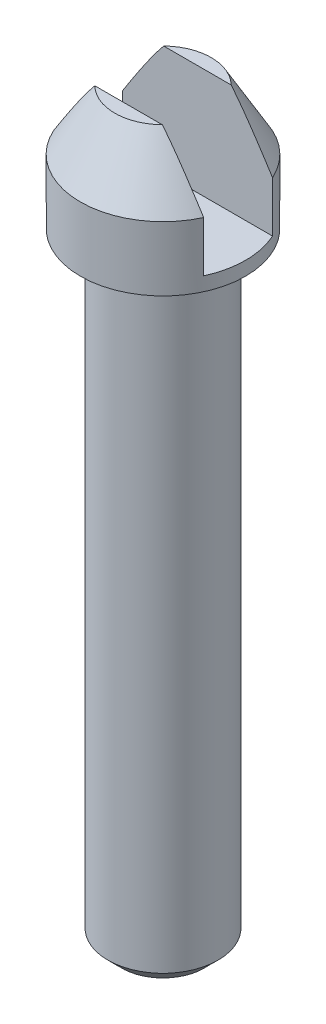
ISO-10303-21;
HEADER;
FILE_DESCRIPTION(('STEP AP214'),'2;1');
FILE_NAME('part.step','',(''),(''),'','','');
FILE_SCHEMA(('AUTOMOTIVE_DESIGN { 1 0 10303 214 1 1 1 1 }'));
ENDSEC;
DATA;
#1=APPLICATION_CONTEXT('core data for automotive mechanical design processes');
#2=APPLICATION_PROTOCOL_DEFINITION('international standard','automotive_design',2000,#1);
#3=PRODUCT_CONTEXT('',#1,'mechanical');
#4=PRODUCT('Part','Part','',(#3));
#5=PRODUCT_RELATED_PRODUCT_CATEGORY('part','',(#4));
#6=PRODUCT_DEFINITION_FORMATION('','',#4);
#7=PRODUCT_DEFINITION_CONTEXT('part definition',#1,'design');
#8=PRODUCT_DEFINITION('design','',#6,#7);
#9=PRODUCT_DEFINITION_SHAPE('','',#8);
#10=(LENGTH_UNIT() NAMED_UNIT(*) SI_UNIT(.MILLI.,.METRE.));
#11=(NAMED_UNIT(*) PLANE_ANGLE_UNIT() SI_UNIT($,.RADIAN.));
#12=(NAMED_UNIT(*) SI_UNIT($,.STERADIAN.) SOLID_ANGLE_UNIT());
#13=UNCERTAINTY_MEASURE_WITH_UNIT(LENGTH_MEASURE(1.E-05),#10,'distance_accuracy_value','');
#14=(GEOMETRIC_REPRESENTATION_CONTEXT(3) GLOBAL_UNCERTAINTY_ASSIGNED_CONTEXT((#13)) GLOBAL_UNIT_ASSIGNED_CONTEXT((#10,
#11,#12)) REPRESENTATION_CONTEXT('',''));
#15=CARTESIAN_POINT('',(0.,0.,0.));
#16=DIRECTION('',(0.,0.,1.));
#17=DIRECTION('',(1.,0.,0.));
#18=AXIS2_PLACEMENT_3D('',#15,#16,#17);
#19=CARTESIAN_POINT('',(0.,54.,0.));
#20=DIRECTION('',(0.,1.,0.));
#21=DIRECTION('',(0.,0.,1.));
#22=AXIS2_PLACEMENT_3D('',#19,#20,#21);
#23=PLANE('',#22);
#24=DIRECTION('',(-1.,0.,0.));
#25=VECTOR('',#24,1.);
#26=CARTESIAN_POINT('',(-7.,54.,-2.5));
#27=LINE('',#26,#25);
#28=CARTESIAN_POINT('',(2.44948974278318,54.,-2.5));
#29=VERTEX_POINT('',#28);
#30=CARTESIAN_POINT('',(-2.44948974278318,54.,-2.5));
#31=VERTEX_POINT('',#30);
#32=EDGE_CURVE('E163',#29,#31,#27,.T.);
#33=ORIENTED_EDGE('',*,*,#32,.F.);
#34=CARTESIAN_POINT('',(0.,54.,0.));
#35=DIRECTION('',(0.,1.,0.));
#36=DIRECTION('',(0.,0.,1.));
#37=AXIS2_PLACEMENT_3D('',#34,#35,#36);
#38=CIRCLE('',#37,3.5);
#39=EDGE_CURVE('E101',#29,#31,#38,.T.);
#40=ORIENTED_EDGE('',*,*,#39,.T.);
#41=EDGE_LOOP('',(#33,#40));
#42=FACE_BOUND('',#41,.T.);
#43=ADVANCED_FACE('F40',(#42),#23,.T.);
#44=CARTESIAN_POINT('',(0.,54.,0.));
#45=DIRECTION('',(0.,-1.,0.));
#46=DIRECTION('',(0.,0.,-1.));
#47=AXIS2_PLACEMENT_3D('',#44,#45,#46);
#48=CONICAL_SURFACE('',#47,3.5,0.5235987755983);
#49=CARTESIAN_POINT('',(10.1150243572424,42.015262487774,-2.5));
#50=CARTESIAN_POINT('',(9.82164000459963,42.5085143245597,-2.5));
#51=CARTESIAN_POINT('',(9.52776285492465,43.0014746764169,-2.5));
#52=CARTESIAN_POINT('',(8.93853471155833,43.9866102558234,-2.5));
#53=CARTESIAN_POINT('',(8.64318351088215,44.4787853595286,-2.5));
#54=CARTESIAN_POINT('',(8.04920877157483,45.4643198153953,-2.5));
#55=CARTESIAN_POINT('',(7.75057637347188,45.9576738349163,-2.5));
#56=CARTESIAN_POINT('',(7.15070639944701,46.9427092080021,-2.5));
#57=CARTESIAN_POINT('',(6.84946916538539,47.434390769605,-2.5));
#58=CARTESIAN_POINT('',(6.23924788404312,48.4218062021742,-2.5));
#59=CARTESIAN_POINT('',(5.93021403988079,48.9175094165565,-2.5));
#60=CARTESIAN_POINT('',(5.4620666609107,49.6583025668912,-2.5));
#61=CARTESIAN_POINT('',(5.30521893712769,49.9048233917141,-2.5));
#62=CARTESIAN_POINT('',(4.98957480821441,50.3966077853454,-2.5));
#63=CARTESIAN_POINT('',(4.83077844994384,50.6418713841866,-2.5));
#64=CARTESIAN_POINT('',(4.51101771311244,51.1301692460033,-2.5));
#65=CARTESIAN_POINT('',(4.35005924918618,51.3732073722148,-2.5));
#66=CARTESIAN_POINT('',(4.02475152476228,51.856996438596,-2.5));
#67=CARTESIAN_POINT('',(3.86040237539508,52.0977474533497,-2.5));
#68=CARTESIAN_POINT('',(3.5271071560068,52.5758512120898,-2.5));
#69=CARTESIAN_POINT('',(3.35816400138818,52.8132059718384,-2.5));
#70=CARTESIAN_POINT('',(3.09963350060949,53.1654534861328,-2.5));
#71=CARTESIAN_POINT('',(3.01261192572288,53.2822284385655,-2.5));
#72=CARTESIAN_POINT('',(2.83644921925044,53.5141660487401,-2.5));
#73=CARTESIAN_POINT('',(2.74730821085155,53.6293287995722,-2.5));
#74=CARTESIAN_POINT('',(2.62563712617981,53.7828029083523,-2.5));
#75=CARTESIAN_POINT('',(2.5942735421931,53.8220406229548,-2.5));
#76=CARTESIAN_POINT('',(2.53120147980525,53.9002392925196,-2.5));
#77=CARTESIAN_POINT('',(2.49949299375984,53.939200241316,-2.5));
#78=CARTESIAN_POINT('',(2.40380302223973,54.0556302816772,-2.5));
#79=CARTESIAN_POINT('',(2.3392613552216,54.1326410851454,-2.5));
#80=CARTESIAN_POINT('',(2.20817538482608,54.2854110263562,-2.5));
#81=CARTESIAN_POINT('',(2.14162487245405,54.3611648509623,-2.5));
#82=CARTESIAN_POINT('',(2.00637997368736,54.5107318454641,-2.5));
#83=CARTESIAN_POINT('',(1.93768573972294,54.5845451526566,-2.5));
#84=CARTESIAN_POINT('',(1.79357038470737,54.7339425424542,-2.5));
#85=CARTESIAN_POINT('',(1.7179912947071,54.8093752057336,-2.5));
#86=CARTESIAN_POINT('',(1.56323216406281,54.9564437684285,-2.5));
#87=CARTESIAN_POINT('',(1.48405310055272,55.0280806868189,-2.5));
#88=CARTESIAN_POINT('',(1.321480738305,55.1658640817066,-2.5));
#89=CARTESIAN_POINT('',(1.23810315747976,55.2320288952581,-2.5));
#90=CARTESIAN_POINT('',(1.06594084269196,55.3568217246648,-2.5));
#91=CARTESIAN_POINT('',(0.977163533277594,55.4154597592502,-2.5));
#92=CARTESIAN_POINT('',(0.80244475713922,55.5164648410281,-2.5));
#93=CARTESIAN_POINT('',(0.717117807262593,55.5598757110237,-2.5));
#94=CARTESIAN_POINT('',(0.541104696539089,55.6342296070284,-2.5));
#95=CARTESIAN_POINT('',(0.450427084787865,55.6651919357381,-2.5));
#96=CARTESIAN_POINT('',(0.31073718172281,55.6994797760284,-2.5));
#97=CARTESIAN_POINT('',(0.263196135694979,55.7089064940752,-2.5));
#98=CARTESIAN_POINT('',(0.167436928462479,55.7231344792985,-2.5));
#99=CARTESIAN_POINT('',(0.119219143293625,55.7279382194819,-2.5));
#100=CARTESIAN_POINT('',(0.0225448118928524,55.7326831908211,-2.5));
#101=CARTESIAN_POINT('',(-0.0259117178833466,55.732624752546,-2.5));
#102=CARTESIAN_POINT('',(-0.122563350592509,55.7276594245864,-2.5));
#103=CARTESIAN_POINT('',(-0.17075846031574,55.7227526614473,-2.5));
#104=CARTESIAN_POINT('',(-0.300973057624577,55.7030907986996,-2.5));
#105=CARTESIAN_POINT('',(-0.382328562644132,55.6837859744636,-2.5));
#106=CARTESIAN_POINT('',(-0.541337037191264,55.633783982483,-2.5));
#107=CARTESIAN_POINT('',(-0.618988558420313,55.6030823990251,-2.5));
#108=CARTESIAN_POINT('',(-0.76635096015828,55.5347579873318,-2.5));
#109=CARTESIAN_POINT('',(-0.836264815430493,55.4975633153704,-2.5));
#110=CARTESIAN_POINT('',(-0.972618529517565,55.417222487782,-2.5));
#111=CARTESIAN_POINT('',(-1.03905507508017,55.3740707935971,-2.5));
#112=CARTESIAN_POINT('',(-1.16909224744055,55.2830918478617,-2.5));
#113=CARTESIAN_POINT('',(-1.23267749831972,55.2352428628138,-2.5));
#114=CARTESIAN_POINT('',(-1.3570687239408,55.1361462434575,-2.5));
#115=CARTESIAN_POINT('',(-1.41787595323743,55.0849001694221,-2.5));
#116=CARTESIAN_POINT('',(-1.59245928816228,54.9310730585791,-2.5));
#117=CARTESIAN_POINT('',(-1.70309261982518,54.824935542555,-2.5));
#118=CARTESIAN_POINT('',(-1.91810791340969,54.6064654146745,-2.5));
#119=CARTESIAN_POINT('',(-2.02248469820014,54.4941278160942,-2.5));
#120=CARTESIAN_POINT('',(-2.22676539530553,54.2650010871153,-2.5));
#121=CARTESIAN_POINT('',(-2.3266581134439,54.1482020318996,-2.5));
#122=CARTESIAN_POINT('',(-2.52284581953697,53.9116161185353,-2.5));
#123=CARTESIAN_POINT('',(-2.61914034951701,53.7918288832672,-2.5));
#124=CARTESIAN_POINT('',(-2.80969800428823,53.5490664802474,-2.5));
#125=CARTESIAN_POINT('',(-2.90393800926764,53.4260732301991,-2.5));
#126=CARTESIAN_POINT('',(-3.09016219265787,53.1783818430093,-2.5));
#127=CARTESIAN_POINT('',(-3.18214620467228,53.0536835811606,-2.5));
#128=CARTESIAN_POINT('',(-3.36413942918698,52.8031717034997,-2.5));
#129=CARTESIAN_POINT('',(-3.4541516541771,52.6773602716224,-2.5));
#130=CARTESIAN_POINT('',(-3.6326826627969,52.42468990242,-2.5));
#131=CARTESIAN_POINT('',(-3.72120149163072,52.2978309969749,-2.5));
#132=CARTESIAN_POINT('',(-3.95454967664953,51.9599426346135,-2.5));
#133=CARTESIAN_POINT('',(-4.09830922005256,51.7481746846424,-2.5));
#134=CARTESIAN_POINT('',(-4.38329826067881,51.3229409135698,-2.5));
#135=CARTESIAN_POINT('',(-4.52452769068554,51.1094750475774,-2.5));
#136=CARTESIAN_POINT('',(-4.80503762770958,50.681240293393,-2.5));
#137=CARTESIAN_POINT('',(-4.94431795538594,50.4664712878691,-2.5));
#138=CARTESIAN_POINT('',(-5.22132602628566,50.0359335781565,-2.5));
#139=CARTESIAN_POINT('',(-5.35905375810433,49.8201648666408,-2.5));
#140=CARTESIAN_POINT('',(-5.77067560330211,49.1712152137728,-2.5));
#141=CARTESIAN_POINT('',(-6.04270738149999,48.7368534685683,-2.5));
#142=CARTESIAN_POINT('',(-6.58341660946496,47.8660859628851,-2.5));
#143=CARTESIAN_POINT('',(-6.85209423601914,47.4296803118159,-2.5));
#144=CARTESIAN_POINT('',(-7.37244940758036,46.579299569729,-2.5));
#145=CARTESIAN_POINT('',(-7.62425361965084,46.1654019228154,-2.5));
#146=CARTESIAN_POINT('',(-8.12627177439667,45.3366346319866,-2.5));
#147=CARTESIAN_POINT('',(-8.37648569011908,44.9217649717596,-2.5));
#148=CARTESIAN_POINT('',(-8.87530056215392,44.0919431984643,-2.5));
#149=CARTESIAN_POINT('',(-9.12390343283301,43.6769922354062,-2.5));
#150=CARTESIAN_POINT('',(-9.62013289043243,42.8465197819367,-2.5));
#151=CARTESIAN_POINT('',(-9.86775949967453,42.4309983048663,-2.5));
#152=CARTESIAN_POINT('',(-10.1150243572424,42.015262487774,-2.5));
#153=B_SPLINE_CURVE_WITH_KNOTS('',3,(#49,#50,#51,#52,#53,#54,#55,#56,#57,#58,#59,#60,#61,#62,
#63,#64,#65,#66,#67,#68,#69,#70,#71,#72,#73,#74,#75,#76,#77,#78,#79,#80,#81,#82,#83,#84,#85,#86,
#87,#88,#89,#90,#91,#92,#93,#94,#95,#96,#97,#98,#99,#100,#101,#102,#103,#104,#105,#106,#107,
#108,#109,#110,#111,#112,#113,#114,#115,#116,#117,#118,#119,#120,#121,#122,#123,#124,#125,#126,
#127,#128,#129,#130,#131,#132,#133,#134,#135,#136,#137,#138,#139,#140,#141,#142,#143,#144,#145,
#146,#147,#148,#149,#150,#151,#152),.UNSPECIFIED.,.F.,.F.,(4,2,2,2,2,2,2,2,2,2,2,2,2,2,2,2,2,2,
2,2,2,2,2,2,2,2,2,2,2,2,2,2,2,2,2,2,2,2,2,2,2,2,2,2,2,2,2,2,2,2,2,4),(0.,1.72172932268304,
3.44370762195679,5.17379244159931,6.90365354958455,8.656050805592,9.53260746314678,
10.4091430828859,11.2836360558098,12.1581004124333,13.0320222121145,13.4689061887635,
13.9057648343626,14.0564597810979,14.207158074605,14.5085756193998,14.8110462608,
15.1134954436817,15.4337433311987,15.7539048074036,16.0729458429507,16.3915577062638,
16.6780887270714,16.964173723486,17.109379907381,17.2545083717081,17.3996269690692,
17.5447417788144,17.7944744599684,18.0443040020665,18.2815087599545,18.5189355638893,
18.7575179086542,18.9959914224799,19.455495990735,19.9153756824306,20.3763459550408,
20.8373747011229,21.3021822796748,21.7670240387945,22.2310975580074,22.6951570047201,
23.4629918149215,24.230846993718,24.9987723659716,25.7667033753992,27.3042212591439,
28.8416577599348,30.2950797283279,31.7485262645281,33.1996930449644,34.6508264504391),.UNSPECIFIED.);
#154=CARTESIAN_POINT('',(5.45435605731786,49.6698729810778,-2.5));
#155=VERTEX_POINT('',#154);
#156=EDGE_CURVE('E180',#155,#29,#153,.T.);
#157=ORIENTED_EDGE('',*,*,#156,.F.);
#158=CARTESIAN_POINT('',(0.,49.6698729810778,0.));
#159=DIRECTION('',(0.,1.,0.));
#160=DIRECTION('',(0.,0.,1.));
#161=AXIS2_PLACEMENT_3D('',#158,#159,#160);
#162=CIRCLE('',#161,6.00000000000001);
#163=CARTESIAN_POINT('',(-5.45435605731786,49.6698729810778,-2.5));
#164=VERTEX_POINT('',#163);
#165=EDGE_CURVE('E114',#155,#164,#162,.T.);
#166=ORIENTED_EDGE('',*,*,#165,.T.);
#167=EDGE_CURVE('E63',#31,#164,#153,.T.);
#168=ORIENTED_EDGE('',*,*,#167,.F.);
#169=ORIENTED_EDGE('',*,*,#39,.F.);
#170=EDGE_LOOP('',(#157,#166,#168,#169));
#171=FACE_BOUND('',#170,.T.);
#172=ADVANCED_FACE('F135',(#171),#48,.T.);
#173=CARTESIAN_POINT('',(-4.,0.,0.));
#174=DIRECTION('',(0.,-1.,0.));
#175=DIRECTION('',(0.,0.,-1.));
#176=AXIS2_PLACEMENT_3D('',#173,#174,#175);
#177=PLANE('',#176);
#178=CARTESIAN_POINT('',(0.,0.,0.));
#179=DIRECTION('',(0.,-1.,0.));
#180=DIRECTION('',(0.,0.,-1.));
#181=AXIS2_PLACEMENT_3D('',#178,#179,#180);
#182=CIRCLE('',#181,3.);
#183=CARTESIAN_POINT('',(0.,0.,-3.));
#184=VERTEX_POINT('',#183);
#185=EDGE_CURVE('E11',#184,#184,#182,.T.);
#186=ORIENTED_EDGE('',*,*,#185,.T.);
#187=EDGE_LOOP('',(#186));
#188=FACE_BOUND('',#187,.T.);
#189=ADVANCED_FACE('F142',(#188),#177,.T.);
#190=DIRECTION('',(1.,0.,0.));
#191=VECTOR('',#190,1.);
#192=CARTESIAN_POINT('',(-7.,54.,2.5));
#193=LINE('',#192,#191);
#194=CARTESIAN_POINT('',(-2.44948974278318,54.,2.5));
#195=VERTEX_POINT('',#194);
#196=CARTESIAN_POINT('',(2.44948974278318,54.,2.5));
#197=VERTEX_POINT('',#196);
#198=EDGE_CURVE('E158',#195,#197,#193,.T.);
#199=ORIENTED_EDGE('',*,*,#198,.F.);
#200=EDGE_CURVE('E160',#195,#197,#38,.T.);
#201=ORIENTED_EDGE('',*,*,#200,.T.);
#202=EDGE_LOOP('',(#199,#201));
#203=FACE_BOUND('',#202,.T.);
#204=ADVANCED_FACE('F138',(#203),#23,.T.);
#205=CARTESIAN_POINT('',(-10.1150243572424,42.015262487774,2.5));
#206=CARTESIAN_POINT('',(-9.82164000459963,42.5085143245597,2.5));
#207=CARTESIAN_POINT('',(-9.52776285492465,43.0014746764169,2.5));
#208=CARTESIAN_POINT('',(-8.93853471155833,43.9866102558234,2.5));
#209=CARTESIAN_POINT('',(-8.64318351088215,44.4787853595286,2.5));
#210=CARTESIAN_POINT('',(-8.04920877157483,45.4643198153953,2.5));
#211=CARTESIAN_POINT('',(-7.75057637347188,45.9576738349163,2.5));
#212=CARTESIAN_POINT('',(-7.15070639944701,46.9427092080021,2.5));
#213=CARTESIAN_POINT('',(-6.84946916538539,47.434390769605,2.5));
#214=CARTESIAN_POINT('',(-6.23924788404312,48.4218062021742,2.5));
#215=CARTESIAN_POINT('',(-5.93021403988079,48.9175094165565,2.5));
#216=CARTESIAN_POINT('',(-5.4620666609107,49.6583025668912,2.5));
#217=CARTESIAN_POINT('',(-5.30521893712769,49.9048233917141,2.5));
#218=CARTESIAN_POINT('',(-4.98957480821441,50.3966077853454,2.5));
#219=CARTESIAN_POINT('',(-4.83077844994384,50.6418713841866,2.5));
#220=CARTESIAN_POINT('',(-4.51101771311244,51.1301692460033,2.5));
#221=CARTESIAN_POINT('',(-4.35005924918618,51.3732073722148,2.5));
#222=CARTESIAN_POINT('',(-4.02475152476228,51.856996438596,2.5));
#223=CARTESIAN_POINT('',(-3.86040237539508,52.0977474533497,2.5));
#224=CARTESIAN_POINT('',(-3.5271071560068,52.5758512120898,2.5));
#225=CARTESIAN_POINT('',(-3.35816400138818,52.8132059718384,2.5));
#226=CARTESIAN_POINT('',(-3.09963350060949,53.1654534861328,2.5));
#227=CARTESIAN_POINT('',(-3.01261192572288,53.2822284385655,2.5));
#228=CARTESIAN_POINT('',(-2.83644921925044,53.5141660487401,2.5));
#229=CARTESIAN_POINT('',(-2.74730821085155,53.6293287995722,2.5));
#230=CARTESIAN_POINT('',(-2.62563712617981,53.7828029083523,2.5));
#231=CARTESIAN_POINT('',(-2.5942735421931,53.8220406229548,2.5));
#232=CARTESIAN_POINT('',(-2.53120147980525,53.9002392925196,2.5));
#233=CARTESIAN_POINT('',(-2.49949299375984,53.939200241316,2.5));
#234=CARTESIAN_POINT('',(-2.40380302223973,54.0556302816772,2.5));
#235=CARTESIAN_POINT('',(-2.3392613552216,54.1326410851454,2.5));
#236=CARTESIAN_POINT('',(-2.20817538482608,54.2854110263562,2.5));
#237=CARTESIAN_POINT('',(-2.14162487245405,54.3611648509623,2.5));
#238=CARTESIAN_POINT('',(-2.00637997368736,54.5107318454641,2.5));
#239=CARTESIAN_POINT('',(-1.93768573972294,54.5845451526566,2.5));
#240=CARTESIAN_POINT('',(-1.79357038470737,54.7339425424542,2.5));
#241=CARTESIAN_POINT('',(-1.7179912947071,54.8093752057336,2.5));
#242=CARTESIAN_POINT('',(-1.56323216406281,54.9564437684285,2.5));
#243=CARTESIAN_POINT('',(-1.48405310055272,55.0280806868189,2.5));
#244=CARTESIAN_POINT('',(-1.321480738305,55.1658640817066,2.5));
#245=CARTESIAN_POINT('',(-1.23810315747976,55.2320288952581,2.5));
#246=CARTESIAN_POINT('',(-1.06594084269196,55.3568217246648,2.5));
#247=CARTESIAN_POINT('',(-0.977163533277594,55.4154597592502,2.5));
#248=CARTESIAN_POINT('',(-0.80244475713922,55.5164648410281,2.5));
#249=CARTESIAN_POINT('',(-0.717117807262593,55.5598757110237,2.5));
#250=CARTESIAN_POINT('',(-0.541104696539089,55.6342296070284,2.5));
#251=CARTESIAN_POINT('',(-0.450427084787865,55.6651919357381,2.5));
#252=CARTESIAN_POINT('',(-0.31073718172281,55.6994797760284,2.5));
#253=CARTESIAN_POINT('',(-0.263196135694979,55.7089064940752,2.5));
#254=CARTESIAN_POINT('',(-0.167436928462479,55.7231344792985,2.5));
#255=CARTESIAN_POINT('',(-0.119219143293625,55.7279382194819,2.5));
#256=CARTESIAN_POINT('',(-0.0225448118928524,55.7326831908211,2.5));
#257=CARTESIAN_POINT('',(0.0259117178833466,55.732624752546,2.5));
#258=CARTESIAN_POINT('',(0.122563350592509,55.7276594245864,2.5));
#259=CARTESIAN_POINT('',(0.17075846031574,55.7227526614473,2.5));
#260=CARTESIAN_POINT('',(0.300973057624577,55.7030907986996,2.5));
#261=CARTESIAN_POINT('',(0.382328562644132,55.6837859744636,2.5));
#262=CARTESIAN_POINT('',(0.541337037191264,55.633783982483,2.5));
#263=CARTESIAN_POINT('',(0.618988558420313,55.6030823990251,2.5));
#264=CARTESIAN_POINT('',(0.76635096015828,55.5347579873318,2.5));
#265=CARTESIAN_POINT('',(0.836264815430493,55.4975633153704,2.5));
#266=CARTESIAN_POINT('',(0.972618529517565,55.417222487782,2.5));
#267=CARTESIAN_POINT('',(1.03905507508017,55.3740707935971,2.5));
#268=CARTESIAN_POINT('',(1.16909224744055,55.2830918478617,2.5));
#269=CARTESIAN_POINT('',(1.23267749831972,55.2352428628138,2.5));
#270=CARTESIAN_POINT('',(1.3570687239408,55.1361462434575,2.5));
#271=CARTESIAN_POINT('',(1.41787595323743,55.0849001694221,2.5));
#272=CARTESIAN_POINT('',(1.59245928816228,54.9310730585791,2.5));
#273=CARTESIAN_POINT('',(1.70309261982518,54.824935542555,2.5));
#274=CARTESIAN_POINT('',(1.91810791340969,54.6064654146745,2.5));
#275=CARTESIAN_POINT('',(2.02248469820014,54.4941278160942,2.5));
#276=CARTESIAN_POINT('',(2.22676539530553,54.2650010871153,2.5));
#277=CARTESIAN_POINT('',(2.3266581134439,54.1482020318996,2.5));
#278=CARTESIAN_POINT('',(2.52284581953697,53.9116161185353,2.5));
#279=CARTESIAN_POINT('',(2.61914034951701,53.7918288832672,2.5));
#280=CARTESIAN_POINT('',(2.80969800428823,53.5490664802474,2.5));
#281=CARTESIAN_POINT('',(2.90393800926764,53.4260732301991,2.5));
#282=CARTESIAN_POINT('',(3.09016219265787,53.1783818430093,2.5));
#283=CARTESIAN_POINT('',(3.18214620467228,53.0536835811606,2.5));
#284=CARTESIAN_POINT('',(3.36413942918698,52.8031717034997,2.5));
#285=CARTESIAN_POINT('',(3.4541516541771,52.6773602716224,2.5));
#286=CARTESIAN_POINT('',(3.6326826627969,52.42468990242,2.5));
#287=CARTESIAN_POINT('',(3.72120149163072,52.2978309969749,2.5));
#288=CARTESIAN_POINT('',(3.95454967664953,51.9599426346135,2.5));
#289=CARTESIAN_POINT('',(4.09830922005256,51.7481746846424,2.5));
#290=CARTESIAN_POINT('',(4.38329826067881,51.3229409135698,2.5));
#291=CARTESIAN_POINT('',(4.52452769068554,51.1094750475774,2.5));
#292=CARTESIAN_POINT('',(4.80503762770958,50.681240293393,2.5));
#293=CARTESIAN_POINT('',(4.94431795538594,50.4664712878691,2.5));
#294=CARTESIAN_POINT('',(5.22132602628566,50.0359335781565,2.5));
#295=CARTESIAN_POINT('',(5.35905375810433,49.8201648666408,2.5));
#296=CARTESIAN_POINT('',(5.77067560330211,49.1712152137728,2.5));
#297=CARTESIAN_POINT('',(6.04270738149999,48.7368534685683,2.5));
#298=CARTESIAN_POINT('',(6.58341660946496,47.8660859628851,2.5));
#299=CARTESIAN_POINT('',(6.85209423601914,47.4296803118159,2.5));
#300=CARTESIAN_POINT('',(7.37244940758036,46.579299569729,2.5));
#301=CARTESIAN_POINT('',(7.62425361965084,46.1654019228154,2.5));
#302=CARTESIAN_POINT('',(8.12627177439667,45.3366346319866,2.5));
#303=CARTESIAN_POINT('',(8.37648569011908,44.9217649717596,2.5));
#304=CARTESIAN_POINT('',(8.87530056215392,44.0919431984643,2.5));
#305=CARTESIAN_POINT('',(9.12390343283301,43.6769922354062,2.5));
#306=CARTESIAN_POINT('',(9.62013289043243,42.8465197819367,2.5));
#307=CARTESIAN_POINT('',(9.86775949967453,42.4309983048663,2.5));
#308=CARTESIAN_POINT('',(10.1150243572424,42.015262487774,2.5));
#309=B_SPLINE_CURVE_WITH_KNOTS('',3,(#205,#206,#207,#208,#209,#210,#211,#212,#213,#214,#215,
#216,#217,#218,#219,#220,#221,#222,#223,#224,#225,#226,#227,#228,#229,#230,#231,#232,#233,#234,
#235,#236,#237,#238,#239,#240,#241,#242,#243,#244,#245,#246,#247,#248,#249,#250,#251,#252,#253,
#254,#255,#256,#257,#258,#259,#260,#261,#262,#263,#264,#265,#266,#267,#268,#269,#270,#271,#272,
#273,#274,#275,#276,#277,#278,#279,#280,#281,#282,#283,#284,#285,#286,#287,#288,#289,#290,#291,
#292,#293,#294,#295,#296,#297,#298,#299,#300,#301,#302,#303,#304,#305,#306,#307,#308),
.UNSPECIFIED.,.F.,.F.,(4,2,2,2,2,2,2,2,2,2,2,2,2,2,2,2,2,2,2,2,2,2,2,2,2,2,2,2,2,2,2,2,2,2,2,2,
2,2,2,2,2,2,2,2,2,2,2,2,2,2,2,4),(0.,1.72172932268304,3.44370762195679,5.17379244159931,
6.90365354958455,8.656050805592,9.53260746314678,10.4091430828859,11.2836360558098,
12.1581004124333,13.0320222121145,13.4689061887635,13.9057648343626,14.0564597810979,
14.207158074605,14.5085756193998,14.8110462608,15.1134954436817,15.4337433311987,
15.7539048074036,16.0729458429507,16.3915577062638,16.6780887270714,16.964173723486,
17.109379907381,17.2545083717081,17.3996269690692,17.5447417788144,17.7944744599684,
18.0443040020665,18.2815087599545,18.5189355638893,18.7575179086542,18.9959914224799,
19.455495990735,19.9153756824306,20.3763459550408,20.8373747011229,21.3021822796748,
21.7670240387945,22.2310975580074,22.6951570047201,23.4629918149215,24.230846993718,
24.9987723659716,25.7667033753992,27.3042212591439,28.8416577599348,30.2950797283279,
31.7485262645281,33.1996930449644,34.6508264504391),.UNSPECIFIED.);
#310=CARTESIAN_POINT('',(-5.45435605731786,49.6698729810778,2.5));
#311=VERTEX_POINT('',#310);
#312=EDGE_CURVE('E108',#311,#195,#309,.T.);
#313=ORIENTED_EDGE('',*,*,#312,.F.);
#314=CARTESIAN_POINT('',(5.45435605731786,49.6698729810778,2.5));
#315=VERTEX_POINT('',#314);
#316=EDGE_CURVE('E171',#311,#315,#162,.T.);
#317=ORIENTED_EDGE('',*,*,#316,.T.);
#318=EDGE_CURVE('E168',#197,#315,#309,.T.);
#319=ORIENTED_EDGE('',*,*,#318,.F.);
#320=ORIENTED_EDGE('',*,*,#200,.F.);
#321=EDGE_LOOP('',(#313,#317,#319,#320));
#322=FACE_BOUND('',#321,.T.);
#323=ADVANCED_FACE('F145',(#322),#48,.T.);
#324=CARTESIAN_POINT('',(0.,0.,0.));
#325=DIRECTION('',(0.,1.,0.));
#326=DIRECTION('',(0.,0.,1.));
#327=AXIS2_PLACEMENT_3D('',#324,#325,#326);
#328=CYLINDRICAL_SURFACE('',#327,6.00000000000001);
#329=DIRECTION('',(0.,1.,0.));
#330=VECTOR('',#329,1.);
#331=CARTESIAN_POINT('',(-5.45435605731786,0.,-2.5));
#332=LINE('',#331,#330);
#333=CARTESIAN_POINT('',(-5.45435605731786,46.,-2.5));
#334=VERTEX_POINT('',#333);
#335=EDGE_CURVE('E107',#164,#334,#332,.F.);
#336=ORIENTED_EDGE('',*,*,#335,.F.);
#337=ORIENTED_EDGE('',*,*,#165,.F.);
#338=DIRECTION('',(0.,1.,0.));
#339=VECTOR('',#338,1.);
#340=CARTESIAN_POINT('',(5.45435605731786,0.,-2.5));
#341=LINE('',#340,#339);
#342=CARTESIAN_POINT('',(5.45435605731786,46.,-2.5));
#343=VERTEX_POINT('',#342);
#344=EDGE_CURVE('E105',#343,#155,#341,.T.);
#345=ORIENTED_EDGE('',*,*,#344,.F.);
#346=CARTESIAN_POINT('',(0.,46.,0.));
#347=DIRECTION('',(0.,1.,0.));
#348=DIRECTION('',(0.,0.,1.));
#349=AXIS2_PLACEMENT_3D('',#346,#347,#348);
#350=CIRCLE('',#349,6.00000000000001);
#351=CARTESIAN_POINT('',(5.45435605731786,46.,2.5));
#352=VERTEX_POINT('',#351);
#353=EDGE_CURVE('E92',#343,#352,#350,.F.);
#354=ORIENTED_EDGE('',*,*,#353,.T.);
#355=DIRECTION('',(0.,1.,0.));
#356=VECTOR('',#355,1.);
#357=CARTESIAN_POINT('',(5.45435605731786,0.,2.5));
#358=LINE('',#357,#356);
#359=EDGE_CURVE('E100',#315,#352,#358,.F.);
#360=ORIENTED_EDGE('',*,*,#359,.F.);
#361=ORIENTED_EDGE('',*,*,#316,.F.);
#362=DIRECTION('',(0.,1.,0.));
#363=VECTOR('',#362,1.);
#364=CARTESIAN_POINT('',(-5.45435605731786,0.,2.5));
#365=LINE('',#364,#363);
#366=CARTESIAN_POINT('',(-5.45435605731786,46.,2.5));
#367=VERTEX_POINT('',#366);
#368=EDGE_CURVE('E116',#367,#311,#365,.T.);
#369=ORIENTED_EDGE('',*,*,#368,.F.);
#370=EDGE_CURVE('E103',#367,#334,#350,.F.);
#371=ORIENTED_EDGE('',*,*,#370,.T.);
#372=EDGE_LOOP('',(#336,#337,#345,#354,#360,#361,#369,#371));
#373=FACE_BOUND('',#372,.T.);
#374=CARTESIAN_POINT('',(0.,45.,0.));
#375=DIRECTION('',(0.,1.,0.));
#376=DIRECTION('',(0.,0.,1.));
#377=AXIS2_PLACEMENT_3D('',#374,#375,#376);
#378=CIRCLE('',#377,6.00000000000001);
#379=CARTESIAN_POINT('',(0.,45.,6.00000000000001));
#380=VERTEX_POINT('',#379);
#381=EDGE_CURVE('E174',#380,#380,#378,.T.);
#382=ORIENTED_EDGE('',*,*,#381,.T.);
#383=EDGE_LOOP('',(#382));
#384=FACE_BOUND('',#383,.T.);
#385=ADVANCED_FACE('F111',(#373,#384),#328,.T.);
#386=CARTESIAN_POINT('',(-6.00000000000001,45.,0.));
#387=DIRECTION('',(0.,-1.,0.));
#388=DIRECTION('',(0.,0.,-1.));
#389=AXIS2_PLACEMENT_3D('',#386,#387,#388);
#390=PLANE('',#389);
#391=CARTESIAN_POINT('',(0.,45.,0.));
#392=DIRECTION('',(0.,1.,0.));
#393=DIRECTION('',(0.,0.,1.));
#394=AXIS2_PLACEMENT_3D('',#391,#392,#393);
#395=CIRCLE('',#394,4.);
#396=CARTESIAN_POINT('',(0.,45.,4.));
#397=VERTEX_POINT('',#396);
#398=EDGE_CURVE('E177',#397,#397,#395,.T.);
#399=ORIENTED_EDGE('',*,*,#398,.T.);
#400=EDGE_LOOP('',(#399));
#401=FACE_BOUND('',#400,.T.);
#402=ORIENTED_EDGE('',*,*,#381,.F.);
#403=EDGE_LOOP('',(#402));
#404=FACE_BOUND('',#403,.T.);
#405=ADVANCED_FACE('F200',(#401,#404),#390,.T.);
#406=CARTESIAN_POINT('',(0.,0.,0.));
#407=DIRECTION('',(0.,1.,0.));
#408=DIRECTION('',(0.,0.,1.));
#409=AXIS2_PLACEMENT_3D('',#406,#407,#408);
#410=CYLINDRICAL_SURFACE('',#409,4.);
#411=CARTESIAN_POINT('',(0.,1.00000000000001,0.));
#412=DIRECTION('',(0.,-1.,0.));
#413=DIRECTION('',(0.,0.,-1.));
#414=AXIS2_PLACEMENT_3D('',#411,#412,#413);
#415=CIRCLE('',#414,4.);
#416=CARTESIAN_POINT('',(0.,1.00000000000001,-4.));
#417=VERTEX_POINT('',#416);
#418=EDGE_CURVE('E48',#417,#417,#415,.F.);
#419=ORIENTED_EDGE('',*,*,#418,.T.);
#420=EDGE_LOOP('',(#419));
#421=FACE_BOUND('',#420,.T.);
#422=ORIENTED_EDGE('',*,*,#398,.F.);
#423=EDGE_LOOP('',(#422));
#424=FACE_BOUND('',#423,.T.);
#425=ADVANCED_FACE('F123',(#421,#424),#410,.T.);
#426=CARTESIAN_POINT('',(-7.,46.,-2.5));
#427=DIRECTION('',(0.,0.,-1.));
#428=DIRECTION('',(-1.,0.,0.));
#429=AXIS2_PLACEMENT_3D('',#426,#427,#428);
#430=PLANE('',#429);
#431=ORIENTED_EDGE('',*,*,#167,.T.);
#432=ORIENTED_EDGE('',*,*,#335,.T.);
#433=DIRECTION('',(-1.,0.,0.));
#434=VECTOR('',#433,1.);
#435=CARTESIAN_POINT('',(-7.,46.,-2.5));
#436=LINE('',#435,#434);
#437=EDGE_CURVE('E95',#343,#334,#436,.T.);
#438=ORIENTED_EDGE('',*,*,#437,.F.);
#439=ORIENTED_EDGE('',*,*,#344,.T.);
#440=ORIENTED_EDGE('',*,*,#156,.T.);
#441=ORIENTED_EDGE('',*,*,#32,.T.);
#442=EDGE_LOOP('',(#431,#432,#438,#439,#440,#441));
#443=FACE_BOUND('',#442,.T.);
#444=ADVANCED_FACE('F104',(#443),#430,.F.);
#445=CARTESIAN_POINT('',(-7.,46.,2.5));
#446=DIRECTION('',(0.,0.,1.));
#447=DIRECTION('',(1.,0.,0.));
#448=AXIS2_PLACEMENT_3D('',#445,#446,#447);
#449=PLANE('',#448);
#450=ORIENTED_EDGE('',*,*,#318,.T.);
#451=ORIENTED_EDGE('',*,*,#359,.T.);
#452=DIRECTION('',(1.,0.,0.));
#453=VECTOR('',#452,1.);
#454=CARTESIAN_POINT('',(-7.,46.,2.5));
#455=LINE('',#454,#453);
#456=EDGE_CURVE('E55',#367,#352,#455,.T.);
#457=ORIENTED_EDGE('',*,*,#456,.F.);
#458=ORIENTED_EDGE('',*,*,#368,.T.);
#459=ORIENTED_EDGE('',*,*,#312,.T.);
#460=ORIENTED_EDGE('',*,*,#198,.T.);
#461=EDGE_LOOP('',(#450,#451,#457,#458,#459,#460));
#462=FACE_BOUND('',#461,.T.);
#463=ADVANCED_FACE('F131',(#462),#449,.F.);
#464=CARTESIAN_POINT('',(0.,46.,0.));
#465=DIRECTION('',(0.,1.,0.));
#466=DIRECTION('',(0.,0.,1.));
#467=AXIS2_PLACEMENT_3D('',#464,#465,#466);
#468=PLANE('',#467);
#469=ORIENTED_EDGE('',*,*,#456,.T.);
#470=ORIENTED_EDGE('',*,*,#353,.F.);
#471=ORIENTED_EDGE('',*,*,#437,.T.);
#472=ORIENTED_EDGE('',*,*,#370,.F.);
#473=EDGE_LOOP('',(#469,#470,#471,#472));
#474=FACE_BOUND('',#473,.T.);
#475=ADVANCED_FACE('F94',(#474),#468,.T.);
#476=CARTESIAN_POINT('',(0.,1.00000000000001,0.));
#477=DIRECTION('',(0.,1.,0.));
#478=DIRECTION('',(0.,0.,1.));
#479=AXIS2_PLACEMENT_3D('',#476,#477,#478);
#480=CONICAL_SURFACE('',#479,4.,0.785398163397448);
#481=ORIENTED_EDGE('',*,*,#185,.F.);
#482=EDGE_LOOP('',(#481));
#483=FACE_BOUND('',#482,.T.);
#484=ORIENTED_EDGE('',*,*,#418,.F.);
#485=EDGE_LOOP('',(#484));
#486=FACE_BOUND('',#485,.T.);
#487=ADVANCED_FACE('F42',(#483,#486),#480,.T.);
#488=CLOSED_SHELL('',(#43,#172,#189,#204,#323,#385,#405,#425,#444,#463,#475,#487));
#489=MANIFOLD_SOLID_BREP('B2',#488);
#490=ADVANCED_BREP_SHAPE_REPRESENTATION('',(#18,#489),#14);
#491=SHAPE_DEFINITION_REPRESENTATION(#9,#490);
ENDSEC;
END-ISO-10303-21;
